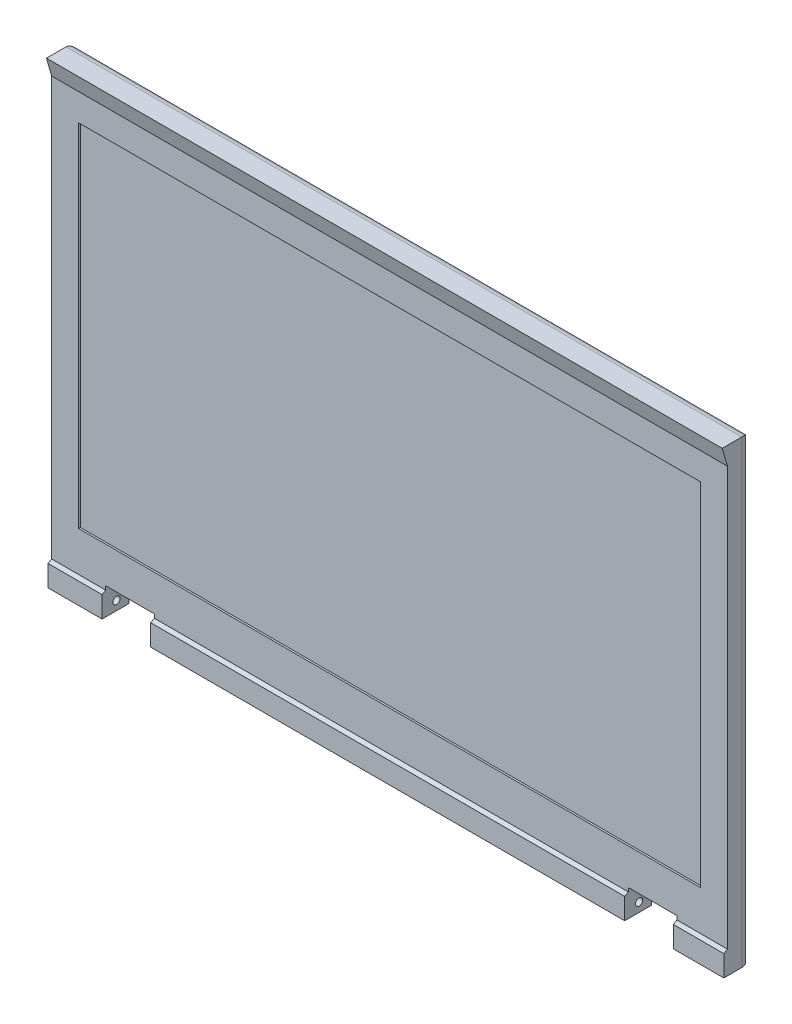
ISO-10303-21;
HEADER;
FILE_DESCRIPTION(('STEP AP214'),'2;1');
FILE_NAME('part.step','',(''),(''),'','','');
FILE_SCHEMA(('AUTOMOTIVE_DESIGN { 1 0 10303 214 1 1 1 1 }'));
ENDSEC;
DATA;
#1=APPLICATION_CONTEXT('core data for automotive mechanical design processes');
#2=APPLICATION_PROTOCOL_DEFINITION('international standard','automotive_design',2000,#1);
#3=PRODUCT_CONTEXT('',#1,'mechanical');
#4=PRODUCT('Part','Part','',(#3));
#5=PRODUCT_RELATED_PRODUCT_CATEGORY('part','',(#4));
#6=PRODUCT_DEFINITION_FORMATION('','',#4);
#7=PRODUCT_DEFINITION_CONTEXT('part definition',#1,'design');
#8=PRODUCT_DEFINITION('design','',#6,#7);
#9=PRODUCT_DEFINITION_SHAPE('','',#8);
#10=(LENGTH_UNIT() NAMED_UNIT(*) SI_UNIT(.MILLI.,.METRE.));
#11=(NAMED_UNIT(*) PLANE_ANGLE_UNIT() SI_UNIT($,.RADIAN.));
#12=(NAMED_UNIT(*) SI_UNIT($,.STERADIAN.) SOLID_ANGLE_UNIT());
#13=UNCERTAINTY_MEASURE_WITH_UNIT(LENGTH_MEASURE(1.E-05),#10,'distance_accuracy_value','');
#14=(GEOMETRIC_REPRESENTATION_CONTEXT(3) GLOBAL_UNCERTAINTY_ASSIGNED_CONTEXT((#13)) GLOBAL_UNIT_ASSIGNED_CONTEXT((#10,
#11,#12)) REPRESENTATION_CONTEXT('',''));
#15=CARTESIAN_POINT('',(0.,0.,0.));
#16=DIRECTION('',(0.,0.,1.));
#17=DIRECTION('',(1.,0.,0.));
#18=AXIS2_PLACEMENT_3D('',#15,#16,#17);
#19=CARTESIAN_POINT('',(30.,0.,-15.));
#20=DIRECTION('',(-1.,0.,0.));
#21=DIRECTION('',(0.,-1.,0.));
#22=AXIS2_PLACEMENT_3D('',#19,#20,#21);
#23=PLANE('',#22);
#24=DIRECTION('',(0.,0.,1.));
#25=VECTOR('',#24,1.);
#26=CARTESIAN_POINT('',(30.,15.,-15.));
#27=LINE('',#26,#25);
#28=CARTESIAN_POINT('',(30.,15.,0.));
#29=VERTEX_POINT('',#28);
#30=CARTESIAN_POINT('',(30.,15.,13.));
#31=VERTEX_POINT('',#30);
#32=EDGE_CURVE('E283',#29,#31,#27,.T.);
#33=ORIENTED_EDGE('',*,*,#32,.T.);
#34=DIRECTION('',(0.,1.,0.));
#35=VECTOR('',#34,1.);
#36=CARTESIAN_POINT('',(30.,9.99999999999936,13.));
#37=LINE('',#36,#35);
#38=CARTESIAN_POINT('',(30.,12.8867513459482,13.));
#39=VERTEX_POINT('',#38);
#40=EDGE_CURVE('E300',#39,#31,#37,.T.);
#41=ORIENTED_EDGE('',*,*,#40,.F.);
#42=DIRECTION('',(0.,-0.500000000000006,0.866025403784435));
#43=VECTOR('',#42,1.);
#44=CARTESIAN_POINT('',(30.,9.99999999999984,18.0000000000003));
#45=LINE('',#44,#43);
#46=CARTESIAN_POINT('',(30.,11.7320508075689,15.));
#47=VERTEX_POINT('',#46);
#48=EDGE_CURVE('E382',#47,#39,#45,.F.);
#49=ORIENTED_EDGE('',*,*,#48,.F.);
#50=DIRECTION('',(0.,-1.,0.));
#51=VECTOR('',#50,1.);
#52=CARTESIAN_POINT('',(30.,0.,15.));
#53=LINE('',#52,#51);
#54=CARTESIAN_POINT('',(30.,0.,15.));
#55=VERTEX_POINT('',#54);
#56=EDGE_CURVE('E277',#47,#55,#53,.T.);
#57=ORIENTED_EDGE('',*,*,#56,.T.);
#58=DIRECTION('',(0.,0.,1.));
#59=VECTOR('',#58,1.);
#60=CARTESIAN_POINT('',(30.,0.,-15.));
#61=LINE('',#60,#59);
#62=CARTESIAN_POINT('',(30.,0.,0.));
#63=VERTEX_POINT('',#62);
#64=EDGE_CURVE('E282',#63,#55,#61,.T.);
#65=ORIENTED_EDGE('',*,*,#64,.F.);
#66=DIRECTION('',(0.,-1.,0.));
#67=VECTOR('',#66,1.);
#68=CARTESIAN_POINT('',(30.,-6.38378239159465E-13,0.));
#69=LINE('',#68,#67);
#70=EDGE_CURVE('E303',#29,#63,#69,.T.);
#71=ORIENTED_EDGE('',*,*,#70,.F.);
#72=EDGE_LOOP('',(#33,#41,#49,#57,#65,#71));
#73=FACE_BOUND('',#72,.T.);
#74=CARTESIAN_POINT('',(30.,5.,7.));
#75=DIRECTION('',(-1.,0.,0.));
#76=DIRECTION('',(0.,-1.,0.));
#77=AXIS2_PLACEMENT_3D('',#74,#75,#76);
#78=CIRCLE('',#77,2.);
#79=CARTESIAN_POINT('',(30.,3.,7.));
#80=VERTEX_POINT('',#79);
#81=EDGE_CURVE('E244',#80,#80,#78,.F.);
#82=ORIENTED_EDGE('',*,*,#81,.F.);
#83=EDGE_LOOP('',(#82));
#84=FACE_BOUND('',#83,.T.);
#85=ADVANCED_FACE('F34',(#73,#84),#23,.F.);
#86=CARTESIAN_POINT('',(57.,0.,-15.));
#87=DIRECTION('',(1.,0.,0.));
#88=DIRECTION('',(0.,0.,-1.));
#89=AXIS2_PLACEMENT_3D('',#86,#87,#88);
#90=PLANE('',#89);
#91=DIRECTION('',(0.,0.,1.));
#92=VECTOR('',#91,1.);
#93=CARTESIAN_POINT('',(57.,0.,-15.));
#94=LINE('',#93,#92);
#95=CARTESIAN_POINT('',(57.,0.,0.));
#96=VERTEX_POINT('',#95);
#97=CARTESIAN_POINT('',(57.,0.,15.));
#98=VERTEX_POINT('',#97);
#99=EDGE_CURVE('E290',#96,#98,#94,.T.);
#100=ORIENTED_EDGE('',*,*,#99,.T.);
#101=DIRECTION('',(0.,1.,0.));
#102=VECTOR('',#101,1.);
#103=CARTESIAN_POINT('',(57.,0.,15.));
#104=LINE('',#103,#102);
#105=CARTESIAN_POINT('',(57.,11.7320508075689,15.));
#106=VERTEX_POINT('',#105);
#107=EDGE_CURVE('E279',#98,#106,#104,.T.);
#108=ORIENTED_EDGE('',*,*,#107,.T.);
#109=DIRECTION('',(0.,0.500000000000006,-0.866025403784435));
#110=VECTOR('',#109,1.);
#111=CARTESIAN_POINT('',(57.,10.,18.));
#112=LINE('',#111,#110);
#113=CARTESIAN_POINT('',(57.,12.8867513459482,13.));
#114=VERTEX_POINT('',#113);
#115=EDGE_CURVE('E379',#114,#106,#112,.F.);
#116=ORIENTED_EDGE('',*,*,#115,.F.);
#117=DIRECTION('',(0.,-1.,0.));
#118=VECTOR('',#117,1.);
#119=CARTESIAN_POINT('',(57.,10.,13.));
#120=LINE('',#119,#118);
#121=CARTESIAN_POINT('',(57.,15.,13.));
#122=VERTEX_POINT('',#121);
#123=EDGE_CURVE('E286',#122,#114,#120,.T.);
#124=ORIENTED_EDGE('',*,*,#123,.F.);
#125=DIRECTION('',(0.,0.,1.));
#126=VECTOR('',#125,1.);
#127=CARTESIAN_POINT('',(57.,15.,-15.));
#128=LINE('',#127,#126);
#129=CARTESIAN_POINT('',(57.,15.,0.));
#130=VERTEX_POINT('',#129);
#131=EDGE_CURVE('E287',#130,#122,#128,.T.);
#132=ORIENTED_EDGE('',*,*,#131,.F.);
#133=DIRECTION('',(0.,1.,0.));
#134=VECTOR('',#133,1.);
#135=CARTESIAN_POINT('',(57.,0.,0.));
#136=LINE('',#135,#134);
#137=EDGE_CURVE('E297',#96,#130,#136,.T.);
#138=ORIENTED_EDGE('',*,*,#137,.F.);
#139=EDGE_LOOP('',(#100,#108,#116,#124,#132,#138));
#140=FACE_BOUND('',#139,.T.);
#141=CARTESIAN_POINT('',(57.,5.,7.));
#142=DIRECTION('',(1.,0.,0.));
#143=DIRECTION('',(0.,0.,-1.));
#144=AXIS2_PLACEMENT_3D('',#141,#142,#143);
#145=CIRCLE('',#144,2.);
#146=CARTESIAN_POINT('',(57.,5.,5.));
#147=VERTEX_POINT('',#146);
#148=EDGE_CURVE('E241',#147,#147,#145,.F.);
#149=ORIENTED_EDGE('',*,*,#148,.F.);
#150=EDGE_LOOP('',(#149));
#151=FACE_BOUND('',#150,.T.);
#152=ADVANCED_FACE('F478',(#140,#151),#90,.F.);
#153=CARTESIAN_POINT('',(320.,0.,-15.));
#154=DIRECTION('',(-1.,0.,0.));
#155=DIRECTION('',(0.,0.,1.));
#156=AXIS2_PLACEMENT_3D('',#153,#154,#155);
#157=PLANE('',#156);
#158=DIRECTION('',(0.,0.,1.));
#159=VECTOR('',#158,1.);
#160=CARTESIAN_POINT('',(320.,15.,-15.));
#161=LINE('',#160,#159);
#162=CARTESIAN_POINT('',(320.,15.,0.));
#163=VERTEX_POINT('',#162);
#164=CARTESIAN_POINT('',(320.,15.,13.));
#165=VERTEX_POINT('',#164);
#166=EDGE_CURVE('E252',#163,#165,#161,.T.);
#167=ORIENTED_EDGE('',*,*,#166,.T.);
#168=DIRECTION('',(0.,1.,0.));
#169=VECTOR('',#168,1.);
#170=CARTESIAN_POINT('',(320.,10.,13.));
#171=LINE('',#170,#169);
#172=CARTESIAN_POINT('',(320.,12.8867513459482,13.));
#173=VERTEX_POINT('',#172);
#174=EDGE_CURVE('E268',#173,#165,#171,.T.);
#175=ORIENTED_EDGE('',*,*,#174,.F.);
#176=DIRECTION('',(0.,-0.500000000000006,0.866025403784435));
#177=VECTOR('',#176,1.);
#178=CARTESIAN_POINT('',(320.,10.,18.));
#179=LINE('',#178,#177);
#180=CARTESIAN_POINT('',(320.,11.7320508075689,15.));
#181=VERTEX_POINT('',#180);
#182=EDGE_CURVE('E391',#181,#173,#179,.F.);
#183=ORIENTED_EDGE('',*,*,#182,.F.);
#184=DIRECTION('',(0.,-1.,0.));
#185=VECTOR('',#184,1.);
#186=CARTESIAN_POINT('',(320.,0.,15.));
#187=LINE('',#186,#185);
#188=CARTESIAN_POINT('',(320.,0.,15.));
#189=VERTEX_POINT('',#188);
#190=EDGE_CURVE('E247',#181,#189,#187,.T.);
#191=ORIENTED_EDGE('',*,*,#190,.T.);
#192=DIRECTION('',(0.,0.,1.));
#193=VECTOR('',#192,1.);
#194=CARTESIAN_POINT('',(320.,0.,-15.));
#195=LINE('',#194,#193);
#196=CARTESIAN_POINT('',(320.,0.,0.));
#197=VERTEX_POINT('',#196);
#198=EDGE_CURVE('E251',#197,#189,#195,.T.);
#199=ORIENTED_EDGE('',*,*,#198,.F.);
#200=DIRECTION('',(0.,-1.,0.));
#201=VECTOR('',#200,1.);
#202=CARTESIAN_POINT('',(320.,0.,0.));
#203=LINE('',#202,#201);
#204=EDGE_CURVE('E271',#163,#197,#203,.T.);
#205=ORIENTED_EDGE('',*,*,#204,.F.);
#206=EDGE_LOOP('',(#167,#175,#183,#191,#199,#205));
#207=FACE_BOUND('',#206,.T.);
#208=CARTESIAN_POINT('',(320.,5.,7.));
#209=DIRECTION('',(-1.,0.,0.));
#210=DIRECTION('',(0.,0.,1.));
#211=AXIS2_PLACEMENT_3D('',#208,#209,#210);
#212=CIRCLE('',#211,2.);
#213=CARTESIAN_POINT('',(320.,5.,5.));
#214=VERTEX_POINT('',#213);
#215=EDGE_CURVE('E238',#214,#214,#212,.F.);
#216=ORIENTED_EDGE('',*,*,#215,.F.);
#217=EDGE_LOOP('',(#216));
#218=FACE_BOUND('',#217,.T.);
#219=ADVANCED_FACE('F449',(#207,#218),#157,.F.);
#220=CARTESIAN_POINT('',(347.,0.,-15.));
#221=DIRECTION('',(1.,0.,0.));
#222=DIRECTION('',(0.,0.,-1.));
#223=AXIS2_PLACEMENT_3D('',#220,#221,#222);
#224=PLANE('',#223);
#225=DIRECTION('',(0.,0.,1.));
#226=VECTOR('',#225,1.);
#227=CARTESIAN_POINT('',(347.,0.,-15.));
#228=LINE('',#227,#226);
#229=CARTESIAN_POINT('',(347.,0.,0.));
#230=VERTEX_POINT('',#229);
#231=CARTESIAN_POINT('',(347.,0.,15.));
#232=VERTEX_POINT('',#231);
#233=EDGE_CURVE('E259',#230,#232,#228,.T.);
#234=ORIENTED_EDGE('',*,*,#233,.T.);
#235=DIRECTION('',(0.,1.,0.));
#236=VECTOR('',#235,1.);
#237=CARTESIAN_POINT('',(347.,0.,15.));
#238=LINE('',#237,#236);
#239=CARTESIAN_POINT('',(347.,11.7320508075689,15.));
#240=VERTEX_POINT('',#239);
#241=EDGE_CURVE('E249',#232,#240,#238,.T.);
#242=ORIENTED_EDGE('',*,*,#241,.T.);
#243=DIRECTION('',(0.,0.500000000000006,-0.866025403784435));
#244=VECTOR('',#243,1.);
#245=CARTESIAN_POINT('',(347.,10.,18.));
#246=LINE('',#245,#244);
#247=CARTESIAN_POINT('',(347.,12.8867513459482,13.));
#248=VERTEX_POINT('',#247);
#249=EDGE_CURVE('E388',#248,#240,#246,.F.);
#250=ORIENTED_EDGE('',*,*,#249,.F.);
#251=DIRECTION('',(0.,-1.,0.));
#252=VECTOR('',#251,1.);
#253=CARTESIAN_POINT('',(347.,10.,13.));
#254=LINE('',#253,#252);
#255=CARTESIAN_POINT('',(347.,15.,13.));
#256=VERTEX_POINT('',#255);
#257=EDGE_CURVE('E255',#256,#248,#254,.T.);
#258=ORIENTED_EDGE('',*,*,#257,.F.);
#259=DIRECTION('',(0.,0.,1.));
#260=VECTOR('',#259,1.);
#261=CARTESIAN_POINT('',(347.,15.,-15.));
#262=LINE('',#261,#260);
#263=CARTESIAN_POINT('',(347.,15.,0.));
#264=VERTEX_POINT('',#263);
#265=EDGE_CURVE('E256',#264,#256,#262,.T.);
#266=ORIENTED_EDGE('',*,*,#265,.F.);
#267=DIRECTION('',(0.,1.,0.));
#268=VECTOR('',#267,1.);
#269=CARTESIAN_POINT('',(347.,0.,0.));
#270=LINE('',#269,#268);
#271=EDGE_CURVE('E265',#230,#264,#270,.T.);
#272=ORIENTED_EDGE('',*,*,#271,.F.);
#273=EDGE_LOOP('',(#234,#242,#250,#258,#266,#272));
#274=FACE_BOUND('',#273,.T.);
#275=CARTESIAN_POINT('',(347.,5.,7.));
#276=DIRECTION('',(1.,0.,0.));
#277=DIRECTION('',(0.,0.,-1.));
#278=AXIS2_PLACEMENT_3D('',#275,#276,#277);
#279=CIRCLE('',#278,2.);
#280=CARTESIAN_POINT('',(347.,5.,5.));
#281=VERTEX_POINT('',#280);
#282=EDGE_CURVE('E237',#281,#281,#279,.F.);
#283=ORIENTED_EDGE('',*,*,#282,.F.);
#284=EDGE_LOOP('',(#283));
#285=FACE_BOUND('',#284,.T.);
#286=ADVANCED_FACE('F431',(#274,#285),#224,.F.);
#287=CARTESIAN_POINT('',(375.,10.,15.));
#288=DIRECTION('',(0.,0.,-1.));
#289=DIRECTION('',(0.,1.,0.));
#290=AXIS2_PLACEMENT_3D('',#287,#288,#289);
#291=PLANE('',#290);
#292=DIRECTION('',(-1.,0.,0.));
#293=VECTOR('',#292,1.);
#294=CARTESIAN_POINT('',(375.,0.,15.));
#295=LINE('',#294,#293);
#296=EDGE_CURVE('E364',#189,#98,#295,.T.);
#297=ORIENTED_EDGE('',*,*,#296,.F.);
#298=ORIENTED_EDGE('',*,*,#190,.F.);
#299=DIRECTION('',(1.,0.,0.));
#300=VECTOR('',#299,1.);
#301=CARTESIAN_POINT('',(375.,11.7320508075689,15.));
#302=LINE('',#301,#300);
#303=EDGE_CURVE('E374',#181,#106,#302,.F.);
#304=ORIENTED_EDGE('',*,*,#303,.T.);
#305=ORIENTED_EDGE('',*,*,#107,.F.);
#306=EDGE_LOOP('',(#297,#298,#304,#305));
#307=FACE_BOUND('',#306,.T.);
#308=ADVANCED_FACE('F475',(#307),#291,.F.);
#309=CARTESIAN_POINT('',(375.,0.,0.));
#310=DIRECTION('',(0.,1.,0.));
#311=DIRECTION('',(0.,0.,1.));
#312=AXIS2_PLACEMENT_3D('',#309,#310,#311);
#313=PLANE('',#312);
#314=DIRECTION('',(-1.,0.,0.));
#315=VECTOR('',#314,1.);
#316=CARTESIAN_POINT('',(375.,0.,0.));
#317=LINE('',#316,#315);
#318=EDGE_CURVE('E359',#197,#96,#317,.T.);
#319=ORIENTED_EDGE('',*,*,#318,.F.);
#320=ORIENTED_EDGE('',*,*,#198,.T.);
#321=ORIENTED_EDGE('',*,*,#296,.T.);
#322=ORIENTED_EDGE('',*,*,#99,.F.);
#323=EDGE_LOOP('',(#319,#320,#321,#322));
#324=FACE_BOUND('',#323,.T.);
#325=ADVANCED_FACE('F455',(#324),#313,.F.);
#326=CARTESIAN_POINT('',(375.,10.,18.));
#327=DIRECTION('',(0.,0.866025403784435,0.500000000000006));
#328=DIRECTION('',(1.,0.,0.));
#329=AXIS2_PLACEMENT_3D('',#326,#327,#328);
#330=PLANE('',#329);
#331=ORIENTED_EDGE('',*,*,#303,.F.);
#332=ORIENTED_EDGE('',*,*,#182,.T.);
#333=DIRECTION('',(1.,0.,0.));
#334=VECTOR('',#333,1.);
#335=CARTESIAN_POINT('',(375.,12.8867513459482,13.));
#336=LINE('',#335,#334);
#337=EDGE_CURVE('E369',#114,#173,#336,.T.);
#338=ORIENTED_EDGE('',*,*,#337,.F.);
#339=ORIENTED_EDGE('',*,*,#115,.T.);
#340=EDGE_LOOP('',(#331,#332,#338,#339));
#341=FACE_BOUND('',#340,.T.);
#342=ADVANCED_FACE('F481',(#341),#330,.T.);
#343=CARTESIAN_POINT('',(0.,0.,15.));
#344=VERTEX_POINT('',#343);
#345=EDGE_CURVE('E358',#55,#344,#295,.T.);
#346=ORIENTED_EDGE('',*,*,#345,.F.);
#347=ORIENTED_EDGE('',*,*,#56,.F.);
#348=CARTESIAN_POINT('',(0.,11.7320508075689,15.));
#349=VERTEX_POINT('',#348);
#350=EDGE_CURVE('E368',#47,#349,#302,.F.);
#351=ORIENTED_EDGE('',*,*,#350,.T.);
#352=DIRECTION('',(0.,-1.,0.));
#353=VECTOR('',#352,1.);
#354=CARTESIAN_POINT('',(0.,10.,15.));
#355=LINE('',#354,#353);
#356=EDGE_CURVE('E351',#349,#344,#355,.T.);
#357=ORIENTED_EDGE('',*,*,#356,.T.);
#358=EDGE_LOOP('',(#346,#347,#351,#357));
#359=FACE_BOUND('',#358,.T.);
#360=ADVANCED_FACE('F467',(#359),#291,.F.);
#361=DIRECTION('',(0.,0.,-1.));
#362=VECTOR('',#361,1.);
#363=CARTESIAN_POINT('',(0.,0.,0.));
#364=LINE('',#363,#362);
#365=CARTESIAN_POINT('',(0.,0.,5.));
#366=VERTEX_POINT('',#365);
#367=EDGE_CURVE('E343',#344,#366,#364,.T.);
#368=ORIENTED_EDGE('',*,*,#367,.T.);
#369=CARTESIAN_POINT('',(5.,0.,5.));
#370=DIRECTION('',(0.,1.,0.));
#371=DIRECTION('',(0.,0.,1.));
#372=AXIS2_PLACEMENT_3D('',#369,#370,#371);
#373=CIRCLE('',#372,5.);
#374=CARTESIAN_POINT('',(5.,0.,0.));
#375=VERTEX_POINT('',#374);
#376=EDGE_CURVE('E408',#366,#375,#373,.F.);
#377=ORIENTED_EDGE('',*,*,#376,.T.);
#378=EDGE_CURVE('E348',#63,#375,#317,.T.);
#379=ORIENTED_EDGE('',*,*,#378,.F.);
#380=ORIENTED_EDGE('',*,*,#64,.T.);
#381=ORIENTED_EDGE('',*,*,#345,.T.);
#382=EDGE_LOOP('',(#368,#377,#379,#380,#381));
#383=FACE_BOUND('',#382,.T.);
#384=ADVANCED_FACE('F461',(#383),#313,.F.);
#385=ORIENTED_EDGE('',*,*,#350,.F.);
#386=ORIENTED_EDGE('',*,*,#48,.T.);
#387=CARTESIAN_POINT('',(0.,12.8867513459482,13.));
#388=VERTEX_POINT('',#387);
#389=EDGE_CURVE('E365',#388,#39,#336,.T.);
#390=ORIENTED_EDGE('',*,*,#389,.F.);
#391=DIRECTION('',(0.,-0.500000000000006,0.866025403784436));
#392=VECTOR('',#391,1.);
#393=CARTESIAN_POINT('',(0.,15.29422863406,8.83012701892233));
#394=LINE('',#393,#392);
#395=EDGE_CURVE('E373',#349,#388,#394,.F.);
#396=ORIENTED_EDGE('',*,*,#395,.F.);
#397=EDGE_LOOP('',(#385,#386,#390,#396));
#398=FACE_BOUND('',#397,.T.);
#399=ADVANCED_FACE('F489',(#398),#330,.T.);
#400=CARTESIAN_POINT('',(375.,0.,0.));
#401=DIRECTION('',(0.,0.,1.));
#402=DIRECTION('',(1.,0.,0.));
#403=AXIS2_PLACEMENT_3D('',#400,#401,#402);
#404=PLANE('',#403);
#405=ORIENTED_EDGE('',*,*,#378,.T.);
#406=DIRECTION('',(0.,1.,0.));
#407=VECTOR('',#406,1.);
#408=CARTESIAN_POINT('',(5.,0.,0.));
#409=LINE('',#408,#407);
#410=CARTESIAN_POINT('',(5.,250.,0.));
#411=VERTEX_POINT('',#410);
#412=EDGE_CURVE('E403',#375,#411,#409,.T.);
#413=ORIENTED_EDGE('',*,*,#412,.T.);
#414=DIRECTION('',(-1.,0.,0.));
#415=VECTOR('',#414,1.);
#416=CARTESIAN_POINT('',(375.,250.,0.));
#417=LINE('',#416,#415);
#418=CARTESIAN_POINT('',(370.,250.,0.));
#419=VERTEX_POINT('',#418);
#420=EDGE_CURVE('E397',#411,#419,#417,.F.);
#421=ORIENTED_EDGE('',*,*,#420,.T.);
#422=DIRECTION('',(0.,1.,0.));
#423=VECTOR('',#422,1.);
#424=CARTESIAN_POINT('',(370.,0.,0.));
#425=LINE('',#424,#423);
#426=CARTESIAN_POINT('',(370.,0.,0.));
#427=VERTEX_POINT('',#426);
#428=EDGE_CURVE('E401',#419,#427,#425,.F.);
#429=ORIENTED_EDGE('',*,*,#428,.T.);
#430=EDGE_CURVE('E356',#427,#230,#317,.T.);
#431=ORIENTED_EDGE('',*,*,#430,.T.);
#432=ORIENTED_EDGE('',*,*,#271,.T.);
#433=DIRECTION('',(-1.,0.,0.));
#434=VECTOR('',#433,1.);
#435=CARTESIAN_POINT('',(375.,15.,0.));
#436=LINE('',#435,#434);
#437=EDGE_CURVE('E274',#264,#163,#436,.T.);
#438=ORIENTED_EDGE('',*,*,#437,.T.);
#439=ORIENTED_EDGE('',*,*,#204,.T.);
#440=ORIENTED_EDGE('',*,*,#318,.T.);
#441=ORIENTED_EDGE('',*,*,#137,.T.);
#442=DIRECTION('',(-1.,0.,0.));
#443=VECTOR('',#442,1.);
#444=CARTESIAN_POINT('',(375.,15.,0.));
#445=LINE('',#444,#443);
#446=EDGE_CURVE('E306',#130,#29,#445,.T.);
#447=ORIENTED_EDGE('',*,*,#446,.T.);
#448=ORIENTED_EDGE('',*,*,#70,.T.);
#449=EDGE_LOOP('',(#405,#413,#421,#429,#431,#432,#438,#439,#440,#441,#447,#448));
#450=FACE_BOUND('',#449,.T.);
#451=ADVANCED_FACE('F424',(#450),#404,.F.);
#452=CARTESIAN_POINT('',(375.,255.,0.));
#453=DIRECTION('',(0.,-1.,0.));
#454=DIRECTION('',(0.,0.,-1.));
#455=AXIS2_PLACEMENT_3D('',#452,#453,#454);
#456=PLANE('',#455);
#457=DIRECTION('',(0.,0.,1.));
#458=VECTOR('',#457,1.);
#459=CARTESIAN_POINT('',(375.,255.,0.));
#460=LINE('',#459,#458);
#461=CARTESIAN_POINT('',(375.,255.,5.));
#462=VERTEX_POINT('',#461);
#463=CARTESIAN_POINT('',(375.,255.,15.867453857588));
#464=VERTEX_POINT('',#463);
#465=EDGE_CURVE('E340',#462,#464,#460,.T.);
#466=ORIENTED_EDGE('',*,*,#465,.F.);
#467=DIRECTION('',(-1.,0.,0.));
#468=VECTOR('',#467,1.);
#469=CARTESIAN_POINT('',(375.,255.,5.));
#470=LINE('',#469,#468);
#471=CARTESIAN_POINT('',(0.,255.,5.));
#472=VERTEX_POINT('',#471);
#473=EDGE_CURVE('E11',#462,#472,#470,.T.);
#474=ORIENTED_EDGE('',*,*,#473,.T.);
#475=DIRECTION('',(0.,0.,1.));
#476=VECTOR('',#475,1.);
#477=CARTESIAN_POINT('',(0.,255.,0.));
#478=LINE('',#477,#476);
#479=CARTESIAN_POINT('',(0.,255.,15.867453857588));
#480=VERTEX_POINT('',#479);
#481=EDGE_CURVE('E203',#472,#480,#478,.T.);
#482=ORIENTED_EDGE('',*,*,#481,.T.);
#483=DIRECTION('',(1.,0.,0.));
#484=VECTOR('',#483,1.);
#485=CARTESIAN_POINT('',(0.,255.,15.867453857588));
#486=LINE('',#485,#484);
#487=EDGE_CURVE('E206',#480,#464,#486,.T.);
#488=ORIENTED_EDGE('',*,*,#487,.T.);
#489=EDGE_LOOP('',(#466,#474,#482,#488));
#490=FACE_BOUND('',#489,.T.);
#491=ADVANCED_FACE('F205',(#490),#456,.F.);
#492=CARTESIAN_POINT('',(375.,10.,13.));
#493=DIRECTION('',(0.,0.,-1.));
#494=DIRECTION('',(-1.,0.,0.));
#495=AXIS2_PLACEMENT_3D('',#492,#493,#494);
#496=PLANE('',#495);
#497=DIRECTION('',(1.,0.,0.));
#498=VECTOR('',#497,1.);
#499=CARTESIAN_POINT('',(15.,35.,13.));
#500=LINE('',#499,#498);
#501=CARTESIAN_POINT('',(15.,35.,13.));
#502=VERTEX_POINT('',#501);
#503=CARTESIAN_POINT('',(360.,35.,13.));
#504=VERTEX_POINT('',#503);
#505=EDGE_CURVE('E325',#502,#504,#500,.T.);
#506=ORIENTED_EDGE('',*,*,#505,.F.);
#507=DIRECTION('',(0.,-1.,0.));
#508=VECTOR('',#507,1.);
#509=CARTESIAN_POINT('',(15.,230.,13.));
#510=LINE('',#509,#508);
#511=CARTESIAN_POINT('',(15.,230.,13.));
#512=VERTEX_POINT('',#511);
#513=EDGE_CURVE('E309',#512,#502,#510,.T.);
#514=ORIENTED_EDGE('',*,*,#513,.F.);
#515=DIRECTION('',(-1.,0.,0.));
#516=VECTOR('',#515,1.);
#517=CARTESIAN_POINT('',(15.,230.,13.));
#518=LINE('',#517,#516);
#519=CARTESIAN_POINT('',(360.,230.,13.));
#520=VERTEX_POINT('',#519);
#521=EDGE_CURVE('E314',#520,#512,#518,.T.);
#522=ORIENTED_EDGE('',*,*,#521,.F.);
#523=DIRECTION('',(0.,1.,0.));
#524=VECTOR('',#523,1.);
#525=CARTESIAN_POINT('',(360.,230.,13.));
#526=LINE('',#525,#524);
#527=EDGE_CURVE('E328',#504,#520,#526,.T.);
#528=ORIENTED_EDGE('',*,*,#527,.F.);
#529=EDGE_LOOP('',(#506,#514,#522,#528));
#530=FACE_BOUND('',#529,.T.);
#531=DIRECTION('',(0.,-1.,0.));
#532=VECTOR('',#531,1.);
#533=CARTESIAN_POINT('',(375.,10.,13.));
#534=LINE('',#533,#532);
#535=CARTESIAN_POINT('',(375.,245.,13.));
#536=VERTEX_POINT('',#535);
#537=CARTESIAN_POINT('',(375.,12.8867513459482,13.));
#538=VERTEX_POINT('',#537);
#539=EDGE_CURVE('E342',#536,#538,#534,.T.);
#540=ORIENTED_EDGE('',*,*,#539,.F.);
#541=DIRECTION('',(1.,0.,0.));
#542=VECTOR('',#541,1.);
#543=CARTESIAN_POINT('',(0.,245.,13.));
#544=LINE('',#543,#542);
#545=CARTESIAN_POINT('',(0.,245.,13.));
#546=VERTEX_POINT('',#545);
#547=EDGE_CURVE('E222',#546,#536,#544,.T.);
#548=ORIENTED_EDGE('',*,*,#547,.F.);
#549=DIRECTION('',(0.,-1.,0.));
#550=VECTOR('',#549,1.);
#551=CARTESIAN_POINT('',(0.,10.,13.));
#552=LINE('',#551,#550);
#553=EDGE_CURVE('E212',#546,#388,#552,.T.);
#554=ORIENTED_EDGE('',*,*,#553,.T.);
#555=ORIENTED_EDGE('',*,*,#389,.T.);
#556=ORIENTED_EDGE('',*,*,#40,.T.);
#557=DIRECTION('',(1.,0.,0.));
#558=VECTOR('',#557,1.);
#559=CARTESIAN_POINT('',(375.,15.,13.));
#560=LINE('',#559,#558);
#561=EDGE_CURVE('E385',#31,#122,#560,.T.);
#562=ORIENTED_EDGE('',*,*,#561,.T.);
#563=ORIENTED_EDGE('',*,*,#123,.T.);
#564=ORIENTED_EDGE('',*,*,#337,.T.);
#565=ORIENTED_EDGE('',*,*,#174,.T.);
#566=DIRECTION('',(1.,0.,0.));
#567=VECTOR('',#566,1.);
#568=CARTESIAN_POINT('',(375.,15.,13.));
#569=LINE('',#568,#567);
#570=EDGE_CURVE('E394',#165,#256,#569,.T.);
#571=ORIENTED_EDGE('',*,*,#570,.T.);
#572=ORIENTED_EDGE('',*,*,#257,.T.);
#573=EDGE_CURVE('E363',#248,#538,#336,.T.);
#574=ORIENTED_EDGE('',*,*,#573,.T.);
#575=EDGE_LOOP('',(#540,#548,#554,#555,#556,#562,#563,#564,#565,#571,#572,#574));
#576=FACE_BOUND('',#575,.T.);
#577=ADVANCED_FACE('F443',(#530,#576),#496,.F.);
#578=CARTESIAN_POINT('',(375.,11.7320508075689,15.));
#579=VERTEX_POINT('',#578);
#580=EDGE_CURVE('E370',#579,#240,#302,.F.);
#581=ORIENTED_EDGE('',*,*,#580,.T.);
#582=ORIENTED_EDGE('',*,*,#241,.F.);
#583=CARTESIAN_POINT('',(375.,0.,15.));
#584=VERTEX_POINT('',#583);
#585=EDGE_CURVE('E360',#584,#232,#295,.T.);
#586=ORIENTED_EDGE('',*,*,#585,.F.);
#587=DIRECTION('',(0.,-1.,0.));
#588=VECTOR('',#587,1.);
#589=CARTESIAN_POINT('',(375.,10.,15.));
#590=LINE('',#589,#588);
#591=EDGE_CURVE('E345',#579,#584,#590,.T.);
#592=ORIENTED_EDGE('',*,*,#591,.F.);
#593=EDGE_LOOP('',(#581,#582,#586,#592));
#594=FACE_BOUND('',#593,.T.);
#595=ADVANCED_FACE('F435',(#594),#291,.F.);
#596=ORIENTED_EDGE('',*,*,#430,.F.);
#597=CARTESIAN_POINT('',(370.,0.,5.));
#598=DIRECTION('',(0.,1.,0.));
#599=DIRECTION('',(0.,0.,1.));
#600=AXIS2_PLACEMENT_3D('',#597,#598,#599);
#601=CIRCLE('',#600,5.);
#602=CARTESIAN_POINT('',(375.,0.,5.));
#603=VERTEX_POINT('',#602);
#604=EDGE_CURVE('E43',#427,#603,#601,.F.);
#605=ORIENTED_EDGE('',*,*,#604,.T.);
#606=DIRECTION('',(0.,0.,-1.));
#607=VECTOR('',#606,1.);
#608=CARTESIAN_POINT('',(375.,0.,13.));
#609=LINE('',#608,#607);
#610=EDGE_CURVE('E347',#584,#603,#609,.T.);
#611=ORIENTED_EDGE('',*,*,#610,.F.);
#612=ORIENTED_EDGE('',*,*,#585,.T.);
#613=ORIENTED_EDGE('',*,*,#233,.F.);
#614=EDGE_LOOP('',(#596,#605,#611,#612,#613));
#615=FACE_BOUND('',#614,.T.);
#616=ADVANCED_FACE('F427',(#615),#313,.F.);
#617=CARTESIAN_POINT('',(375.,0.,0.));
#618=DIRECTION('',(1.,0.,0.));
#619=DIRECTION('',(0.,0.,-1.));
#620=AXIS2_PLACEMENT_3D('',#617,#618,#619);
#621=PLANE('',#620);
#622=ORIENTED_EDGE('',*,*,#610,.T.);
#623=DIRECTION('',(0.,1.,0.));
#624=VECTOR('',#623,1.);
#625=CARTESIAN_POINT('',(375.,255.,5.));
#626=LINE('',#625,#624);
#627=EDGE_CURVE('E57',#603,#462,#626,.T.);
#628=ORIENTED_EDGE('',*,*,#627,.T.);
#629=ORIENTED_EDGE('',*,*,#465,.T.);
#630=DIRECTION('',(0.,-0.96126169593832,-0.275637355816995));
#631=VECTOR('',#630,1.);
#632=CARTESIAN_POINT('',(375.,245.,13.));
#633=LINE('',#632,#631);
#634=EDGE_CURVE('E221',#464,#536,#633,.T.);
#635=ORIENTED_EDGE('',*,*,#634,.T.);
#636=ORIENTED_EDGE('',*,*,#539,.T.);
#637=DIRECTION('',(0.,0.500000000000006,-0.866025403784436));
#638=VECTOR('',#637,1.);
#639=CARTESIAN_POINT('',(375.,10.,18.));
#640=LINE('',#639,#638);
#641=EDGE_CURVE('E376',#538,#579,#640,.F.);
#642=ORIENTED_EDGE('',*,*,#641,.T.);
#643=ORIENTED_EDGE('',*,*,#591,.T.);
#644=EDGE_LOOP('',(#622,#628,#629,#635,#636,#642,#643));
#645=FACE_BOUND('',#644,.T.);
#646=ADVANCED_FACE('F529',(#645),#621,.T.);
#647=CARTESIAN_POINT('',(0.,0.,0.));
#648=DIRECTION('',(1.,0.,0.));
#649=DIRECTION('',(0.,0.,-1.));
#650=AXIS2_PLACEMENT_3D('',#647,#648,#649);
#651=PLANE('',#650);
#652=ORIENTED_EDGE('',*,*,#481,.F.);
#653=DIRECTION('',(0.,1.,0.));
#654=VECTOR('',#653,1.);
#655=CARTESIAN_POINT('',(0.,0.,5.));
#656=LINE('',#655,#654);
#657=EDGE_CURVE('E406',#472,#366,#656,.F.);
#658=ORIENTED_EDGE('',*,*,#657,.T.);
#659=ORIENTED_EDGE('',*,*,#367,.F.);
#660=ORIENTED_EDGE('',*,*,#356,.F.);
#661=ORIENTED_EDGE('',*,*,#395,.T.);
#662=ORIENTED_EDGE('',*,*,#553,.F.);
#663=DIRECTION('',(0.,-0.96126169593832,-0.275637355816995));
#664=VECTOR('',#663,1.);
#665=CARTESIAN_POINT('',(0.,245.,13.));
#666=LINE('',#665,#664);
#667=EDGE_CURVE('E219',#480,#546,#666,.T.);
#668=ORIENTED_EDGE('',*,*,#667,.F.);
#669=EDGE_LOOP('',(#652,#658,#659,#660,#661,#662,#668));
#670=FACE_BOUND('',#669,.T.);
#671=ADVANCED_FACE('F224',(#670),#651,.F.);
#672=CARTESIAN_POINT('',(15.,230.,12.));
#673=DIRECTION('',(-1.,0.,0.));
#674=DIRECTION('',(0.,-1.,0.));
#675=AXIS2_PLACEMENT_3D('',#672,#673,#674);
#676=PLANE('',#675);
#677=ORIENTED_EDGE('',*,*,#513,.T.);
#678=DIRECTION('',(0.,0.,1.));
#679=VECTOR('',#678,1.);
#680=CARTESIAN_POINT('',(15.,35.,12.));
#681=LINE('',#680,#679);
#682=CARTESIAN_POINT('',(15.,35.,12.));
#683=VERTEX_POINT('',#682);
#684=EDGE_CURVE('E323',#683,#502,#681,.T.);
#685=ORIENTED_EDGE('',*,*,#684,.F.);
#686=DIRECTION('',(0.,-1.,0.));
#687=VECTOR('',#686,1.);
#688=CARTESIAN_POINT('',(15.,230.,12.));
#689=LINE('',#688,#687);
#690=CARTESIAN_POINT('',(15.,230.,12.));
#691=VERTEX_POINT('',#690);
#692=EDGE_CURVE('E310',#691,#683,#689,.T.);
#693=ORIENTED_EDGE('',*,*,#692,.F.);
#694=DIRECTION('',(0.,0.,1.));
#695=VECTOR('',#694,1.);
#696=CARTESIAN_POINT('',(15.,230.,12.));
#697=LINE('',#696,#695);
#698=EDGE_CURVE('E213',#691,#512,#697,.T.);
#699=ORIENTED_EDGE('',*,*,#698,.T.);
#700=EDGE_LOOP('',(#677,#685,#693,#699));
#701=FACE_BOUND('',#700,.T.);
#702=ADVANCED_FACE('F518',(#701),#676,.F.);
#703=CARTESIAN_POINT('',(15.,230.,12.));
#704=DIRECTION('',(0.,1.,0.));
#705=DIRECTION('',(0.,0.,1.));
#706=AXIS2_PLACEMENT_3D('',#703,#704,#705);
#707=PLANE('',#706);
#708=ORIENTED_EDGE('',*,*,#521,.T.);
#709=ORIENTED_EDGE('',*,*,#698,.F.);
#710=DIRECTION('',(-1.,0.,0.));
#711=VECTOR('',#710,1.);
#712=CARTESIAN_POINT('',(15.,230.,12.));
#713=LINE('',#712,#711);
#714=CARTESIAN_POINT('',(360.,230.,12.));
#715=VERTEX_POINT('',#714);
#716=EDGE_CURVE('E320',#715,#691,#713,.T.);
#717=ORIENTED_EDGE('',*,*,#716,.F.);
#718=DIRECTION('',(0.,0.,1.));
#719=VECTOR('',#718,1.);
#720=CARTESIAN_POINT('',(360.,230.,12.));
#721=LINE('',#720,#719);
#722=EDGE_CURVE('E334',#715,#520,#721,.T.);
#723=ORIENTED_EDGE('',*,*,#722,.T.);
#724=EDGE_LOOP('',(#708,#709,#717,#723));
#725=FACE_BOUND('',#724,.T.);
#726=ADVANCED_FACE('F514',(#725),#707,.F.);
#727=CARTESIAN_POINT('',(360.,230.,12.));
#728=DIRECTION('',(1.,0.,0.));
#729=DIRECTION('',(0.,0.,-1.));
#730=AXIS2_PLACEMENT_3D('',#727,#728,#729);
#731=PLANE('',#730);
#732=ORIENTED_EDGE('',*,*,#527,.T.);
#733=ORIENTED_EDGE('',*,*,#722,.F.);
#734=DIRECTION('',(0.,1.,0.));
#735=VECTOR('',#734,1.);
#736=CARTESIAN_POINT('',(360.,230.,12.));
#737=LINE('',#736,#735);
#738=CARTESIAN_POINT('',(360.,35.,12.));
#739=VERTEX_POINT('',#738);
#740=EDGE_CURVE('E317',#739,#715,#737,.T.);
#741=ORIENTED_EDGE('',*,*,#740,.F.);
#742=DIRECTION('',(0.,0.,1.));
#743=VECTOR('',#742,1.);
#744=CARTESIAN_POINT('',(360.,35.,12.));
#745=LINE('',#744,#743);
#746=EDGE_CURVE('E336',#739,#504,#745,.T.);
#747=ORIENTED_EDGE('',*,*,#746,.T.);
#748=EDGE_LOOP('',(#732,#733,#741,#747));
#749=FACE_BOUND('',#748,.T.);
#750=ADVANCED_FACE('F517',(#749),#731,.F.);
#751=CARTESIAN_POINT('',(15.,35.,12.));
#752=DIRECTION('',(0.,-1.,0.));
#753=DIRECTION('',(0.,0.,-1.));
#754=AXIS2_PLACEMENT_3D('',#751,#752,#753);
#755=PLANE('',#754);
#756=ORIENTED_EDGE('',*,*,#505,.T.);
#757=ORIENTED_EDGE('',*,*,#746,.F.);
#758=DIRECTION('',(1.,0.,0.));
#759=VECTOR('',#758,1.);
#760=CARTESIAN_POINT('',(15.,35.,12.));
#761=LINE('',#760,#759);
#762=EDGE_CURVE('E313',#683,#739,#761,.T.);
#763=ORIENTED_EDGE('',*,*,#762,.F.);
#764=ORIENTED_EDGE('',*,*,#684,.T.);
#765=EDGE_LOOP('',(#756,#757,#763,#764));
#766=FACE_BOUND('',#765,.T.);
#767=ADVANCED_FACE('F512',(#766),#755,.F.);
#768=CARTESIAN_POINT('',(0.,0.,12.));
#769=DIRECTION('',(0.,0.,1.));
#770=DIRECTION('',(1.,0.,0.));
#771=AXIS2_PLACEMENT_3D('',#768,#769,#770);
#772=PLANE('',#771);
#773=ORIENTED_EDGE('',*,*,#692,.T.);
#774=ORIENTED_EDGE('',*,*,#762,.T.);
#775=ORIENTED_EDGE('',*,*,#740,.T.);
#776=ORIENTED_EDGE('',*,*,#716,.T.);
#777=EDGE_LOOP('',(#773,#774,#775,#776));
#778=FACE_BOUND('',#777,.T.);
#779=ADVANCED_FACE('F500',(#778),#772,.T.);
#780=ORIENTED_EDGE('',*,*,#573,.F.);
#781=ORIENTED_EDGE('',*,*,#249,.T.);
#782=ORIENTED_EDGE('',*,*,#580,.F.);
#783=ORIENTED_EDGE('',*,*,#641,.F.);
#784=EDGE_LOOP('',(#780,#781,#782,#783));
#785=FACE_BOUND('',#784,.T.);
#786=ADVANCED_FACE('F440',(#785),#330,.T.);
#787=CARTESIAN_POINT('',(30.,15.,-15.));
#788=DIRECTION('',(0.,1.,0.));
#789=DIRECTION('',(0.,0.,1.));
#790=AXIS2_PLACEMENT_3D('',#787,#788,#789);
#791=PLANE('',#790);
#792=ORIENTED_EDGE('',*,*,#131,.T.);
#793=ORIENTED_EDGE('',*,*,#561,.F.);
#794=ORIENTED_EDGE('',*,*,#32,.F.);
#795=ORIENTED_EDGE('',*,*,#446,.F.);
#796=EDGE_LOOP('',(#792,#793,#794,#795));
#797=FACE_BOUND('',#796,.T.);
#798=ADVANCED_FACE('F484',(#797),#791,.F.);
#799=CARTESIAN_POINT('',(320.,15.,-15.));
#800=DIRECTION('',(0.,1.,0.));
#801=DIRECTION('',(0.,0.,1.));
#802=AXIS2_PLACEMENT_3D('',#799,#800,#801);
#803=PLANE('',#802);
#804=ORIENTED_EDGE('',*,*,#265,.T.);
#805=ORIENTED_EDGE('',*,*,#570,.F.);
#806=ORIENTED_EDGE('',*,*,#166,.F.);
#807=ORIENTED_EDGE('',*,*,#437,.F.);
#808=EDGE_LOOP('',(#804,#805,#806,#807));
#809=FACE_BOUND('',#808,.T.);
#810=ADVANCED_FACE('F447',(#809),#803,.F.);
#811=CARTESIAN_POINT('',(357.,5.,7.));
#812=DIRECTION('',(-1.,0.,0.));
#813=DIRECTION('',(0.,0.,1.));
#814=AXIS2_PLACEMENT_3D('',#811,#812,#813);
#815=PLANE('',#814);
#816=CARTESIAN_POINT('',(357.,5.,7.));
#817=DIRECTION('',(-1.,0.,0.));
#818=DIRECTION('',(0.,0.,1.));
#819=AXIS2_PLACEMENT_3D('',#816,#817,#818);
#820=CIRCLE('',#819,2.);
#821=CARTESIAN_POINT('',(357.,5.,9.));
#822=VERTEX_POINT('',#821);
#823=EDGE_CURVE('E230',#822,#822,#820,.T.);
#824=ORIENTED_EDGE('',*,*,#823,.T.);
#825=EDGE_LOOP('',(#824));
#826=FACE_BOUND('',#825,.T.);
#827=ADVANCED_FACE('F603',(#826),#815,.T.);
#828=CARTESIAN_POINT('',(17.,5.,7.));
#829=DIRECTION('',(1.,0.,0.));
#830=DIRECTION('',(0.,0.,-1.));
#831=AXIS2_PLACEMENT_3D('',#828,#829,#830);
#832=CYLINDRICAL_SURFACE('',#831,2.);
#833=ORIENTED_EDGE('',*,*,#823,.F.);
#834=EDGE_LOOP('',(#833));
#835=FACE_BOUND('',#834,.T.);
#836=ORIENTED_EDGE('',*,*,#282,.T.);
#837=EDGE_LOOP('',(#836));
#838=FACE_BOUND('',#837,.T.);
#839=ADVANCED_FACE('F610',(#835,#838),#832,.F.);
#840=CARTESIAN_POINT('',(320.,5.,5.));
#841=CARTESIAN_POINT('',(317.260416666667,5.,5.));
#842=CARTESIAN_POINT('',(314.520833333333,5.,5.));
#843=CARTESIAN_POINT('',(309.041666666667,5.,5.));
#844=CARTESIAN_POINT('',(306.302083333333,5.,5.));
#845=CARTESIAN_POINT('',(300.822916666667,5.,5.));
#846=CARTESIAN_POINT('',(298.083333333333,5.,5.));
#847=CARTESIAN_POINT('',(292.604166666667,5.,5.));
#848=CARTESIAN_POINT('',(289.864583333333,5.,5.));
#849=CARTESIAN_POINT('',(284.385416666667,5.,5.));
#850=CARTESIAN_POINT('',(281.645833333333,5.,5.));
#851=CARTESIAN_POINT('',(276.166666666667,5.,5.));
#852=CARTESIAN_POINT('',(273.427083333333,5.,5.));
#853=CARTESIAN_POINT('',(267.947916666667,5.,5.));
#854=CARTESIAN_POINT('',(265.208333333333,5.,5.));
#855=CARTESIAN_POINT('',(259.729166666667,5.,5.));
#856=CARTESIAN_POINT('',(256.989583333333,5.,5.));
#857=CARTESIAN_POINT('',(251.510416666667,5.,5.));
#858=CARTESIAN_POINT('',(248.770833333333,5.,5.));
#859=CARTESIAN_POINT('',(243.291666666667,5.,5.));
#860=CARTESIAN_POINT('',(240.552083333333,5.,5.));
#861=CARTESIAN_POINT('',(235.072916666667,5.,5.));
#862=CARTESIAN_POINT('',(232.333333333333,5.,5.));
#863=CARTESIAN_POINT('',(226.854166666667,5.,5.));
#864=CARTESIAN_POINT('',(224.114583333333,5.,5.));
#865=CARTESIAN_POINT('',(218.635416666667,5.,5.));
#866=CARTESIAN_POINT('',(215.895833333333,5.,5.));
#867=CARTESIAN_POINT('',(210.416666666667,5.,5.));
#868=CARTESIAN_POINT('',(207.677083333333,5.,5.));
#869=CARTESIAN_POINT('',(202.197916666667,5.,5.));
#870=CARTESIAN_POINT('',(199.458333333333,5.,5.));
#871=CARTESIAN_POINT('',(193.979166666667,5.,5.));
#872=CARTESIAN_POINT('',(191.239583333333,5.,5.));
#873=CARTESIAN_POINT('',(185.760416666667,5.,5.));
#874=CARTESIAN_POINT('',(183.020833333333,5.,5.));
#875=CARTESIAN_POINT('',(177.541666666667,5.,5.));
#876=CARTESIAN_POINT('',(174.802083333333,5.,5.));
#877=CARTESIAN_POINT('',(169.322916666667,5.,5.));
#878=CARTESIAN_POINT('',(166.583333333333,5.,5.));
#879=CARTESIAN_POINT('',(161.104166666667,5.,5.));
#880=CARTESIAN_POINT('',(158.364583333333,5.,5.));
#881=CARTESIAN_POINT('',(152.885416666667,5.,5.));
#882=CARTESIAN_POINT('',(150.145833333333,5.,5.));
#883=CARTESIAN_POINT('',(144.666666666667,5.,5.));
#884=CARTESIAN_POINT('',(141.927083333333,5.,5.));
#885=CARTESIAN_POINT('',(136.447916666667,5.,5.));
#886=CARTESIAN_POINT('',(133.708333333333,5.,5.));
#887=CARTESIAN_POINT('',(128.229166666667,5.,5.));
#888=CARTESIAN_POINT('',(125.489583333333,5.,5.));
#889=CARTESIAN_POINT('',(120.010416666667,5.,5.));
#890=CARTESIAN_POINT('',(117.270833333333,5.,5.));
#891=CARTESIAN_POINT('',(111.791666666667,5.,5.));
#892=CARTESIAN_POINT('',(109.052083333333,5.,5.));
#893=CARTESIAN_POINT('',(103.572916666667,5.,5.));
#894=CARTESIAN_POINT('',(100.833333333333,5.,5.));
#895=CARTESIAN_POINT('',(95.3541666666666,5.,5.));
#896=CARTESIAN_POINT('',(92.6145833333333,5.,5.));
#897=CARTESIAN_POINT('',(87.1354166666666,5.,5.));
#898=CARTESIAN_POINT('',(84.3958333333333,5.,5.));
#899=CARTESIAN_POINT('',(78.9166666666666,5.,5.));
#900=CARTESIAN_POINT('',(76.1770833333333,5.,5.));
#901=CARTESIAN_POINT('',(70.6979166666666,5.,5.));
#902=CARTESIAN_POINT('',(67.9583333333333,5.,5.));
#903=CARTESIAN_POINT('',(62.4791666666666,5.,5.));
#904=CARTESIAN_POINT('',(59.7395833333333,5.,5.));
#905=CARTESIAN_POINT('',(57.,5.,5.));
#906=B_SPLINE_CURVE_WITH_KNOTS('',3,(#840,#841,#842,#843,#844,#845,#846,#847,#848,#849,#850,
#851,#852,#853,#854,#855,#856,#857,#858,#859,#860,#861,#862,#863,#864,#865,#866,#867,#868,#869,
#870,#871,#872,#873,#874,#875,#876,#877,#878,#879,#880,#881,#882,#883,#884,#885,#886,#887,#888,
#889,#890,#891,#892,#893,#894,#895,#896,#897,#898,#899,#900,#901,#902,#903,#904,#905),
.UNSPECIFIED.,.F.,.F.,(4,2,2,2,2,2,2,2,2,2,2,2,2,2,2,2,2,2,2,2,2,2,2,2,2,2,2,2,2,2,2,2,4),(0.,
8.21875,16.4375,24.65625,32.875,41.09375,49.3125,57.53125,65.75,73.96875,82.1875,90.40625,
98.625,106.84375,115.0625,123.28125,131.5,139.71875,147.9375,156.15625,164.375,172.59375,
180.8125,189.03125,197.25,205.46875,213.6875,221.90625,230.125,238.34375,246.5625,254.78125,
263.),.UNSPECIFIED.);
#907=EDGE_CURVE('BSEAM619',#214,#147,#906,.T.);
#908=ORIENTED_EDGE('',*,*,#215,.T.);
#909=ORIENTED_EDGE('',*,*,#148,.T.);
#910=ORIENTED_EDGE('',*,*,#907,.T.);
#911=ORIENTED_EDGE('',*,*,#907,.F.);
#912=EDGE_LOOP('',(#908,#910,#909,#911));
#913=FACE_BOUND('',#912,.T.);
#914=ADVANCED_FACE('F619',(#913),#832,.F.);
#915=CARTESIAN_POINT('',(17.,5.,7.));
#916=DIRECTION('',(-1.,0.,0.));
#917=DIRECTION('',(0.,0.,1.));
#918=AXIS2_PLACEMENT_3D('',#915,#916,#917);
#919=CIRCLE('',#918,2.);
#920=CARTESIAN_POINT('',(17.,5.,9.));
#921=VERTEX_POINT('',#920);
#922=EDGE_CURVE('E234',#921,#921,#919,.T.);
#923=ORIENTED_EDGE('',*,*,#922,.T.);
#924=EDGE_LOOP('',(#923));
#925=FACE_BOUND('',#924,.T.);
#926=ORIENTED_EDGE('',*,*,#81,.T.);
#927=EDGE_LOOP('',(#926));
#928=FACE_BOUND('',#927,.T.);
#929=ADVANCED_FACE('F622',(#925,#928),#832,.F.);
#930=CARTESIAN_POINT('',(17.,5.,7.));
#931=DIRECTION('',(-1.,0.,0.));
#932=DIRECTION('',(0.,0.,1.));
#933=AXIS2_PLACEMENT_3D('',#930,#931,#932);
#934=PLANE('',#933);
#935=ORIENTED_EDGE('',*,*,#922,.F.);
#936=EDGE_LOOP('',(#935));
#937=FACE_BOUND('',#936,.T.);
#938=ADVANCED_FACE('F634',(#937),#934,.F.);
#939=CARTESIAN_POINT('',(0.,245.,13.));
#940=DIRECTION('',(0.,-0.275637355816995,0.96126169593832));
#941=DIRECTION('',(0.,-0.96126169593832,-0.275637355816995));
#942=AXIS2_PLACEMENT_3D('',#939,#940,#941);
#943=PLANE('',#942);
#944=ORIENTED_EDGE('',*,*,#634,.F.);
#945=ORIENTED_EDGE('',*,*,#487,.F.);
#946=ORIENTED_EDGE('',*,*,#667,.T.);
#947=ORIENTED_EDGE('',*,*,#547,.T.);
#948=EDGE_LOOP('',(#944,#945,#946,#947));
#949=FACE_BOUND('',#948,.T.);
#950=ADVANCED_FACE('F217',(#949),#943,.T.);
#951=CARTESIAN_POINT('',(370.,0.,5.));
#952=DIRECTION('',(0.,-1.,0.));
#953=DIRECTION('',(0.,0.,-1.));
#954=AXIS2_PLACEMENT_3D('',#951,#952,#953);
#955=CYLINDRICAL_SURFACE('',#954,5.);
#956=ORIENTED_EDGE('',*,*,#604,.F.);
#957=ORIENTED_EDGE('',*,*,#428,.F.);
#958=CARTESIAN_POINT('',(370.,250.,5.));
#959=DIRECTION('',(-0.707106781186547,0.707106781186547,0.));
#960=DIRECTION('',(-0.707106781186547,-0.707106781186547,0.));
#961=AXIS2_PLACEMENT_3D('',#958,#959,#960);
#962=ELLIPSE('',#961,7.07106781186547,5.);
#963=EDGE_CURVE('E38',#462,#419,#962,.T.);
#964=ORIENTED_EDGE('',*,*,#963,.F.);
#965=ORIENTED_EDGE('',*,*,#627,.F.);
#966=EDGE_LOOP('',(#956,#957,#964,#965));
#967=FACE_BOUND('',#966,.T.);
#968=ADVANCED_FACE('F36',(#967),#955,.T.);
#969=CARTESIAN_POINT('',(375.,250.,5.));
#970=DIRECTION('',(-1.,0.,0.));
#971=DIRECTION('',(0.,0.,1.));
#972=AXIS2_PLACEMENT_3D('',#969,#970,#971);
#973=CYLINDRICAL_SURFACE('',#972,5.);
#974=ORIENTED_EDGE('',*,*,#963,.T.);
#975=ORIENTED_EDGE('',*,*,#420,.F.);
#976=CARTESIAN_POINT('',(5.,250.,5.));
#977=DIRECTION('',(-0.707106781186547,-0.707106781186547,0.));
#978=DIRECTION('',(-0.707106781186547,0.707106781186547,0.));
#979=AXIS2_PLACEMENT_3D('',#976,#977,#978);
#980=ELLIPSE('',#979,7.07106781186547,5.);
#981=EDGE_CURVE('E411',#472,#411,#980,.T.);
#982=ORIENTED_EDGE('',*,*,#981,.F.);
#983=ORIENTED_EDGE('',*,*,#473,.F.);
#984=EDGE_LOOP('',(#974,#975,#982,#983));
#985=FACE_BOUND('',#984,.T.);
#986=ADVANCED_FACE('F419',(#985),#973,.T.);
#987=CARTESIAN_POINT('',(5.,0.,5.));
#988=DIRECTION('',(0.,1.,0.));
#989=DIRECTION('',(0.,0.,1.));
#990=AXIS2_PLACEMENT_3D('',#987,#988,#989);
#991=CYLINDRICAL_SURFACE('',#990,5.);
#992=ORIENTED_EDGE('',*,*,#376,.F.);
#993=ORIENTED_EDGE('',*,*,#657,.F.);
#994=ORIENTED_EDGE('',*,*,#981,.T.);
#995=ORIENTED_EDGE('',*,*,#412,.F.);
#996=EDGE_LOOP('',(#992,#993,#994,#995));
#997=FACE_BOUND('',#996,.T.);
#998=ADVANCED_FACE('F460',(#997),#991,.T.);
#999=CLOSED_SHELL('',(#85,#152,#219,#286,#308,#325,#342,#360,#384,#399,#451,#491,#577,#595,#616,
#646,#671,#702,#726,#750,#767,#779,#786,#798,#810,#827,#839,#914,#929,#938,#950,#968,#986,#998));
#1000=MANIFOLD_SOLID_BREP('B2',#999);
#1001=ADVANCED_BREP_SHAPE_REPRESENTATION('',(#18,#1000),#14);
#1002=SHAPE_DEFINITION_REPRESENTATION(#9,#1001);
ENDSEC;
END-ISO-10303-21;
